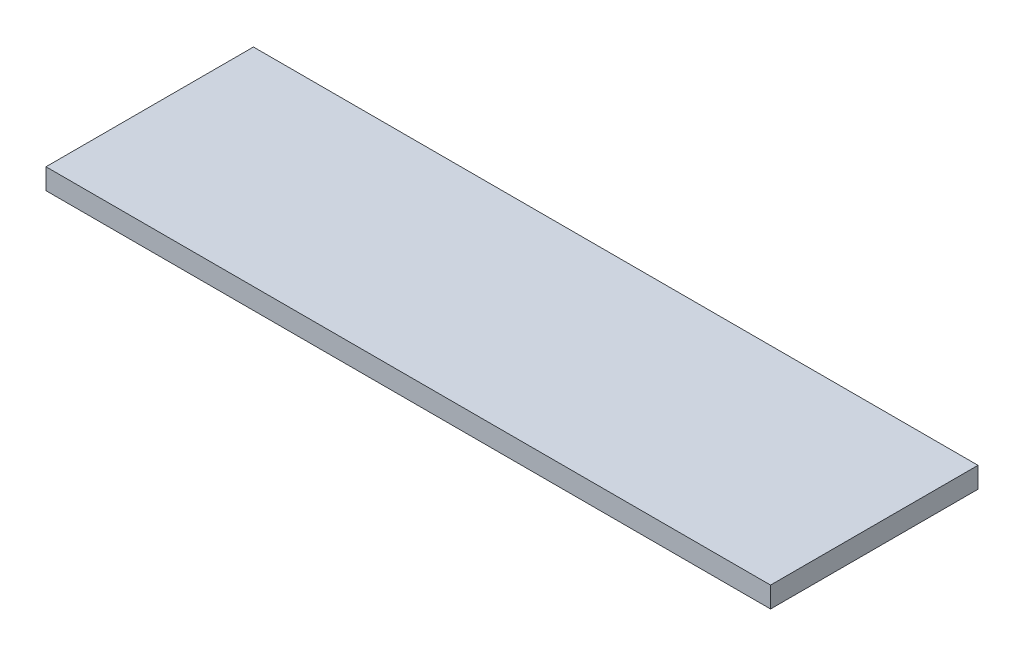
ISO-10303-21;
HEADER;
FILE_DESCRIPTION(('STEP AP214'),'2;1');
FILE_NAME('part.step','',(''),(''),'','','');
FILE_SCHEMA(('AUTOMOTIVE_DESIGN { 1 0 10303 214 1 1 1 1 }'));
ENDSEC;
DATA;
#1=APPLICATION_CONTEXT('core data for automotive mechanical design processes');
#2=APPLICATION_PROTOCOL_DEFINITION('international standard','automotive_design',2000,#1);
#3=PRODUCT_CONTEXT('',#1,'mechanical');
#4=PRODUCT('Part','Part','',(#3));
#5=PRODUCT_RELATED_PRODUCT_CATEGORY('part','',(#4));
#6=PRODUCT_DEFINITION_FORMATION('','',#4);
#7=PRODUCT_DEFINITION_CONTEXT('part definition',#1,'design');
#8=PRODUCT_DEFINITION('design','',#6,#7);
#9=PRODUCT_DEFINITION_SHAPE('','',#8);
#10=(LENGTH_UNIT() NAMED_UNIT(*) SI_UNIT(.MILLI.,.METRE.));
#11=(NAMED_UNIT(*) PLANE_ANGLE_UNIT() SI_UNIT($,.RADIAN.));
#12=(NAMED_UNIT(*) SI_UNIT($,.STERADIAN.) SOLID_ANGLE_UNIT());
#13=UNCERTAINTY_MEASURE_WITH_UNIT(LENGTH_MEASURE(1.E-05),#10,'distance_accuracy_value','');
#14=(GEOMETRIC_REPRESENTATION_CONTEXT(3) GLOBAL_UNCERTAINTY_ASSIGNED_CONTEXT((#13)) GLOBAL_UNIT_ASSIGNED_CONTEXT((#10,
#11,#12)) REPRESENTATION_CONTEXT('',''));
#15=CARTESIAN_POINT('',(0.,0.,0.));
#16=DIRECTION('',(0.,0.,1.));
#17=DIRECTION('',(1.,0.,0.));
#18=AXIS2_PLACEMENT_3D('',#15,#16,#17);
#19=CARTESIAN_POINT('',(18.9269908169872,2.,10.));
#20=DIRECTION('',(0.,0.,1.));
#21=DIRECTION('',(0.,-1.,0.));
#22=AXIS2_PLACEMENT_3D('',#19,#20,#21);
#23=PLANE('',#22);
#24=DIRECTION('',(1.,0.,0.));
#25=VECTOR('',#24,1.);
#26=CARTESIAN_POINT('',(19.9269908169872,0.,10.));
#27=LINE('',#26,#25);
#28=CARTESIAN_POINT('',(0.,0.,10.));
#29=VERTEX_POINT('',#28);
#30=CARTESIAN_POINT('',(34.9269908169872,0.,10.));
#31=VERTEX_POINT('',#30);
#32=EDGE_CURVE('E102',#29,#31,#27,.T.);
#33=ORIENTED_EDGE('',*,*,#32,.F.);
#34=DIRECTION('',(0.,1.,0.));
#35=VECTOR('',#34,1.);
#36=CARTESIAN_POINT('',(0.,-1.,10.));
#37=LINE('',#36,#35);
#38=CARTESIAN_POINT('',(0.,-1.,10.));
#39=VERTEX_POINT('',#38);
#40=EDGE_CURVE('E99',#39,#29,#37,.T.);
#41=ORIENTED_EDGE('',*,*,#40,.F.);
#42=DIRECTION('',(1.,0.,0.));
#43=VECTOR('',#42,1.);
#44=CARTESIAN_POINT('',(19.9269908169872,-1.,10.));
#45=LINE('',#44,#43);
#46=CARTESIAN_POINT('',(34.9269908169872,-1.,10.));
#47=VERTEX_POINT('',#46);
#48=EDGE_CURVE('E88',#39,#47,#45,.T.);
#49=ORIENTED_EDGE('',*,*,#48,.T.);
#50=DIRECTION('',(0.,-1.,0.));
#51=VECTOR('',#50,1.);
#52=CARTESIAN_POINT('',(34.9269908169872,0.,10.));
#53=LINE('',#52,#51);
#54=EDGE_CURVE('E91',#31,#47,#53,.T.);
#55=ORIENTED_EDGE('',*,*,#54,.F.);
#56=EDGE_LOOP('',(#33,#41,#49,#55));
#57=FACE_BOUND('',#56,.T.);
#58=ADVANCED_FACE('F44',(#57),#23,.T.);
#59=CARTESIAN_POINT('',(19.9269908169872,-1.,10.));
#60=DIRECTION('',(0.,1.,0.));
#61=DIRECTION('',(0.,0.,1.));
#62=AXIS2_PLACEMENT_3D('',#59,#60,#61);
#63=PLANE('',#62);
#64=DIRECTION('',(1.,0.,0.));
#65=VECTOR('',#64,1.);
#66=CARTESIAN_POINT('',(19.9269908169872,-1.,0.));
#67=LINE('',#66,#65);
#68=CARTESIAN_POINT('',(0.,-1.,0.));
#69=VERTEX_POINT('',#68);
#70=CARTESIAN_POINT('',(34.9269908169872,-1.,0.));
#71=VERTEX_POINT('',#70);
#72=EDGE_CURVE('E77',#69,#71,#67,.T.);
#73=ORIENTED_EDGE('',*,*,#72,.T.);
#74=DIRECTION('',(0.,0.,-1.));
#75=VECTOR('',#74,1.);
#76=CARTESIAN_POINT('',(34.9269908169872,-1.,10.));
#77=LINE('',#76,#75);
#78=EDGE_CURVE('E12',#47,#71,#77,.T.);
#79=ORIENTED_EDGE('',*,*,#78,.F.);
#80=ORIENTED_EDGE('',*,*,#48,.F.);
#81=DIRECTION('',(0.,0.,-1.));
#82=VECTOR('',#81,1.);
#83=CARTESIAN_POINT('',(0.,-1.,10.));
#84=LINE('',#83,#82);
#85=EDGE_CURVE('E90',#39,#69,#84,.T.);
#86=ORIENTED_EDGE('',*,*,#85,.T.);
#87=EDGE_LOOP('',(#73,#79,#80,#86));
#88=FACE_BOUND('',#87,.T.);
#89=ADVANCED_FACE('F86',(#88),#63,.F.);
#90=CARTESIAN_POINT('',(34.9269908169872,0.,10.));
#91=DIRECTION('',(1.,0.,0.));
#92=DIRECTION('',(0.,0.,1.));
#93=AXIS2_PLACEMENT_3D('',#90,#91,#92);
#94=PLANE('',#93);
#95=DIRECTION('',(0.,-1.,0.));
#96=VECTOR('',#95,1.);
#97=CARTESIAN_POINT('',(34.9269908169872,0.,0.));
#98=LINE('',#97,#96);
#99=CARTESIAN_POINT('',(34.9269908169872,0.,0.));
#100=VERTEX_POINT('',#99);
#101=EDGE_CURVE('E111',#100,#71,#98,.T.);
#102=ORIENTED_EDGE('',*,*,#101,.F.);
#103=DIRECTION('',(0.,0.,-1.));
#104=VECTOR('',#103,1.);
#105=CARTESIAN_POINT('',(34.9269908169872,0.,10.));
#106=LINE('',#105,#104);
#107=EDGE_CURVE('E53',#31,#100,#106,.T.);
#108=ORIENTED_EDGE('',*,*,#107,.F.);
#109=ORIENTED_EDGE('',*,*,#54,.T.);
#110=ORIENTED_EDGE('',*,*,#78,.T.);
#111=EDGE_LOOP('',(#102,#108,#109,#110));
#112=FACE_BOUND('',#111,.T.);
#113=ADVANCED_FACE('F118',(#112),#94,.T.);
#114=CARTESIAN_POINT('',(0.,0.,10.));
#115=DIRECTION('',(0.,1.,0.));
#116=DIRECTION('',(0.,0.,1.));
#117=AXIS2_PLACEMENT_3D('',#114,#115,#116);
#118=PLANE('',#117);
#119=DIRECTION('',(1.,0.,0.));
#120=VECTOR('',#119,1.);
#121=CARTESIAN_POINT('',(19.9269908169872,0.,0.));
#122=LINE('',#121,#120);
#123=CARTESIAN_POINT('',(0.,0.,0.));
#124=VERTEX_POINT('',#123);
#125=EDGE_CURVE('E94',#124,#100,#122,.T.);
#126=ORIENTED_EDGE('',*,*,#125,.F.);
#127=DIRECTION('',(0.,0.,-1.));
#128=VECTOR('',#127,1.);
#129=CARTESIAN_POINT('',(0.,0.,10.));
#130=LINE('',#129,#128);
#131=EDGE_CURVE('E106',#29,#124,#130,.T.);
#132=ORIENTED_EDGE('',*,*,#131,.F.);
#133=ORIENTED_EDGE('',*,*,#32,.T.);
#134=ORIENTED_EDGE('',*,*,#107,.T.);
#135=EDGE_LOOP('',(#126,#132,#133,#134));
#136=FACE_BOUND('',#135,.T.);
#137=ADVANCED_FACE('F50',(#136),#118,.T.);
#138=CARTESIAN_POINT('',(21.9269908169872,2.,0.));
#139=DIRECTION('',(0.,0.,-1.));
#140=DIRECTION('',(0.,1.,0.));
#141=AXIS2_PLACEMENT_3D('',#138,#139,#140);
#142=PLANE('',#141);
#143=ORIENTED_EDGE('',*,*,#72,.F.);
#144=DIRECTION('',(0.,1.,0.));
#145=VECTOR('',#144,1.);
#146=CARTESIAN_POINT('',(0.,-1.,0.));
#147=LINE('',#146,#145);
#148=EDGE_CURVE('E101',#69,#124,#147,.T.);
#149=ORIENTED_EDGE('',*,*,#148,.T.);
#150=ORIENTED_EDGE('',*,*,#125,.T.);
#151=ORIENTED_EDGE('',*,*,#101,.T.);
#152=EDGE_LOOP('',(#143,#149,#150,#151));
#153=FACE_BOUND('',#152,.T.);
#154=ADVANCED_FACE('F119',(#153),#142,.T.);
#155=CARTESIAN_POINT('',(0.,-1.,10.));
#156=DIRECTION('',(-1.,0.,0.));
#157=DIRECTION('',(0.,0.,1.));
#158=AXIS2_PLACEMENT_3D('',#155,#156,#157);
#159=PLANE('',#158);
#160=ORIENTED_EDGE('',*,*,#148,.F.);
#161=ORIENTED_EDGE('',*,*,#85,.F.);
#162=ORIENTED_EDGE('',*,*,#40,.T.);
#163=ORIENTED_EDGE('',*,*,#131,.T.);
#164=EDGE_LOOP('',(#160,#161,#162,#163));
#165=FACE_BOUND('',#164,.T.);
#166=ADVANCED_FACE('F98',(#165),#159,.T.);
#167=CLOSED_SHELL('',(#58,#89,#113,#137,#154,#166));
#168=MANIFOLD_SOLID_BREP('B2',#167);
#169=ADVANCED_BREP_SHAPE_REPRESENTATION('',(#18,#168),#14);
#170=SHAPE_DEFINITION_REPRESENTATION(#9,#169);
ENDSEC;
END-ISO-10303-21;
